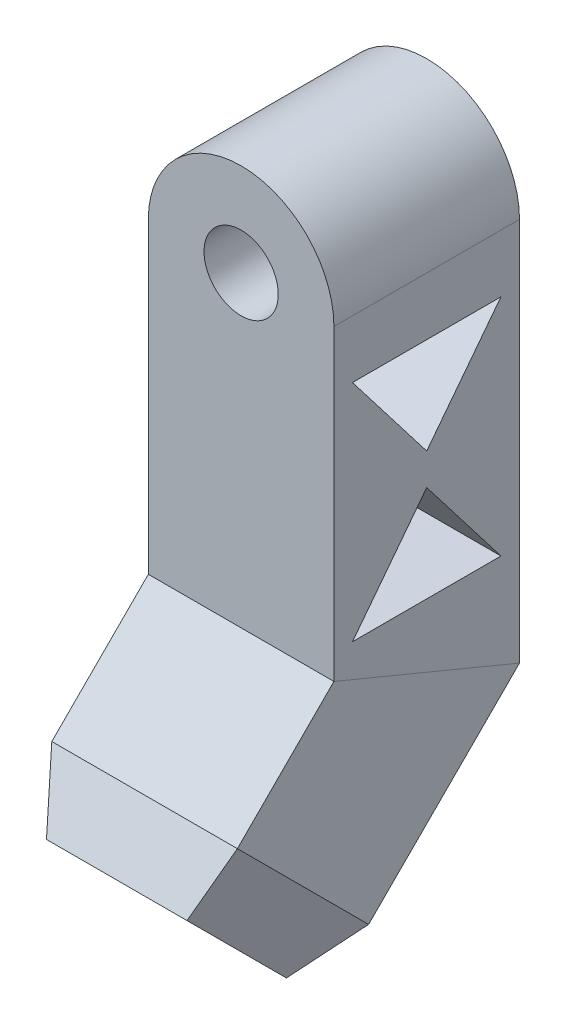
ISO-10303-21;
HEADER;
FILE_DESCRIPTION(('STEP AP214'),'2;1');
FILE_NAME('part.step','',(''),(''),'','','');
FILE_SCHEMA(('AUTOMOTIVE_DESIGN { 1 0 10303 214 1 1 1 1 }'));
ENDSEC;
DATA;
#1=APPLICATION_CONTEXT('core data for automotive mechanical design processes');
#2=APPLICATION_PROTOCOL_DEFINITION('international standard','automotive_design',2000,#1);
#3=PRODUCT_CONTEXT('',#1,'mechanical');
#4=PRODUCT('Part','Part','',(#3));
#5=PRODUCT_RELATED_PRODUCT_CATEGORY('part','',(#4));
#6=PRODUCT_DEFINITION_FORMATION('','',#4);
#7=PRODUCT_DEFINITION_CONTEXT('part definition',#1,'design');
#8=PRODUCT_DEFINITION('design','',#6,#7);
#9=PRODUCT_DEFINITION_SHAPE('','',#8);
#10=(LENGTH_UNIT() NAMED_UNIT(*) SI_UNIT(.MILLI.,.METRE.));
#11=(NAMED_UNIT(*) PLANE_ANGLE_UNIT() SI_UNIT($,.RADIAN.));
#12=(NAMED_UNIT(*) SI_UNIT($,.STERADIAN.) SOLID_ANGLE_UNIT());
#13=UNCERTAINTY_MEASURE_WITH_UNIT(LENGTH_MEASURE(1.E-05),#10,'distance_accuracy_value','');
#14=(GEOMETRIC_REPRESENTATION_CONTEXT(3) GLOBAL_UNCERTAINTY_ASSIGNED_CONTEXT((#13)) GLOBAL_UNIT_ASSIGNED_CONTEXT((#10,
#11,#12)) REPRESENTATION_CONTEXT('',''));
#15=CARTESIAN_POINT('',(0.,0.,0.));
#16=DIRECTION('',(0.,0.,1.));
#17=DIRECTION('',(1.,0.,0.));
#18=AXIS2_PLACEMENT_3D('',#15,#16,#17);
#19=CARTESIAN_POINT('',(19.05,45.0786722599583,7.26209610324912));
#20=DIRECTION('',(-1.,0.,0.));
#21=DIRECTION('',(0.,0.,1.));
#22=AXIS2_PLACEMENT_3D('',#19,#20,#21);
#23=PLANE('',#22);
#24=DIRECTION('',(0.,0.382683432365091,0.923879532511287));
#25=VECTOR('',#24,1.);
#26=CARTESIAN_POINT('',(19.05,42.5318762324136,41.3600079491902));
#27=LINE('',#26,#25);
#28=CARTESIAN_POINT('',(19.05,17.5092316367925,-19.05));
#29=VERTEX_POINT('',#28);
#30=CARTESIAN_POINT('',(19.05,33.2907683632075,19.05));
#31=VERTEX_POINT('',#30);
#32=EDGE_CURVE('E241',#29,#31,#27,.T.);
#33=ORIENTED_EDGE('',*,*,#32,.T.);
#34=DIRECTION('',(0.,-0.707106781186546,0.707106781186549));
#35=VECTOR('',#34,1.);
#36=CARTESIAN_POINT('',(19.05,45.0786722599583,7.26209610324912));
#37=LINE('',#36,#35);
#38=CARTESIAN_POINT('',(19.05,13.4703841816038,38.8703841816038));
#39=VERTEX_POINT('',#38);
#40=EDGE_CURVE('E47',#31,#39,#37,.T.);
#41=ORIENTED_EDGE('',*,*,#40,.T.);
#42=DIRECTION('',(0.,-0.707106781186549,-0.707106781186546));
#43=VECTOR('',#42,1.);
#44=CARTESIAN_POINT('',(19.05,13.4703841816038,38.8703841816038));
#45=LINE('',#44,#43);
#46=CARTESIAN_POINT('',(19.05,-13.4703841816038,11.9296158183964));
#47=VERTEX_POINT('',#46);
#48=EDGE_CURVE('E270',#39,#47,#45,.T.);
#49=ORIENTED_EDGE('',*,*,#48,.T.);
#50=DIRECTION('',(0.,-0.707106781186546,0.707106781186549));
#51=VECTOR('',#50,1.);
#52=CARTESIAN_POINT('',(19.05,18.1379038967508,-19.6786722599583));
#53=LINE('',#52,#51);
#54=EDGE_CURVE('E278',#29,#47,#53,.T.);
#55=ORIENTED_EDGE('',*,*,#54,.F.);
#56=EDGE_LOOP('',(#33,#41,#49,#55));
#57=FACE_BOUND('',#56,.T.);
#58=ADVANCED_FACE('F43',(#57),#23,.F.);
#59=CARTESIAN_POINT('',(-19.05,18.1379038967508,-19.6786722599583));
#60=DIRECTION('',(0.,0.707106781186549,0.707106781186546));
#61=DIRECTION('',(0.,-0.707106781186546,0.707106781186549));
#62=AXIS2_PLACEMENT_3D('',#59,#60,#61);
#63=PLANE('',#62);
#64=DIRECTION('',(1.,0.,0.));
#65=VECTOR('',#64,1.);
#66=CARTESIAN_POINT('',(-19.05,17.5092316367925,-19.05));
#67=LINE('',#66,#65);
#68=CARTESIAN_POINT('',(-19.05,17.5092316367925,-19.05));
#69=VERTEX_POINT('',#68);
#70=EDGE_CURVE('E11',#69,#29,#67,.T.);
#71=ORIENTED_EDGE('',*,*,#70,.T.);
#72=ORIENTED_EDGE('',*,*,#54,.T.);
#73=DIRECTION('',(-1.,0.,0.));
#74=VECTOR('',#73,1.);
#75=CARTESIAN_POINT('',(-19.05,-13.4703841816038,11.9296158183964));
#76=LINE('',#75,#74);
#77=CARTESIAN_POINT('',(-19.05,-13.4703841816038,11.9296158183964));
#78=VERTEX_POINT('',#77);
#79=EDGE_CURVE('E267',#47,#78,#76,.T.);
#80=ORIENTED_EDGE('',*,*,#79,.T.);
#81=DIRECTION('',(0.,-0.707106781186546,0.707106781186549));
#82=VECTOR('',#81,1.);
#83=CARTESIAN_POINT('',(-19.05,18.1379038967508,-19.6786722599583));
#84=LINE('',#83,#82);
#85=EDGE_CURVE('E276',#69,#78,#84,.T.);
#86=ORIENTED_EDGE('',*,*,#85,.F.);
#87=EDGE_LOOP('',(#71,#72,#80,#86));
#88=FACE_BOUND('',#87,.T.);
#89=ADVANCED_FACE('F300',(#88),#63,.F.);
#90=CARTESIAN_POINT('',(-19.05,45.0786722599583,7.26209610324912));
#91=DIRECTION('',(1.,0.,0.));
#92=DIRECTION('',(0.,0.,-1.));
#93=AXIS2_PLACEMENT_3D('',#90,#91,#92);
#94=PLANE('',#93);
#95=DIRECTION('',(0.,-0.382683432365091,-0.923879532511287));
#96=VECTOR('',#95,1.);
#97=CARTESIAN_POINT('',(-19.05,42.5318762324136,41.3600079491902));
#98=LINE('',#97,#96);
#99=CARTESIAN_POINT('',(-19.05,33.2907683632075,19.05));
#100=VERTEX_POINT('',#99);
#101=EDGE_CURVE('E52',#100,#69,#98,.T.);
#102=ORIENTED_EDGE('',*,*,#101,.T.);
#103=ORIENTED_EDGE('',*,*,#85,.T.);
#104=DIRECTION('',(0.,0.707106781186549,0.707106781186546));
#105=VECTOR('',#104,1.);
#106=CARTESIAN_POINT('',(-19.05,13.4703841816038,38.8703841816038));
#107=LINE('',#106,#105);
#108=CARTESIAN_POINT('',(-19.05,13.4703841816038,38.8703841816038));
#109=VERTEX_POINT('',#108);
#110=EDGE_CURVE('E264',#78,#109,#107,.T.);
#111=ORIENTED_EDGE('',*,*,#110,.T.);
#112=DIRECTION('',(0.,-0.707106781186546,0.707106781186549));
#113=VECTOR('',#112,1.);
#114=CARTESIAN_POINT('',(-19.05,45.0786722599583,7.26209610324912));
#115=LINE('',#114,#113);
#116=EDGE_CURVE('E273',#100,#109,#115,.T.);
#117=ORIENTED_EDGE('',*,*,#116,.F.);
#118=EDGE_LOOP('',(#102,#103,#111,#117));
#119=FACE_BOUND('',#118,.T.);
#120=ADVANCED_FACE('F298',(#119),#94,.F.);
#121=CARTESIAN_POINT('',(-19.05,45.0786722599583,7.26209610324912));
#122=DIRECTION('',(0.,-0.707106781186549,-0.707106781186546));
#123=DIRECTION('',(0.,0.707106781186546,-0.707106781186549));
#124=AXIS2_PLACEMENT_3D('',#121,#122,#123);
#125=PLANE('',#124);
#126=DIRECTION('',(-1.,0.,0.));
#127=VECTOR('',#126,1.);
#128=CARTESIAN_POINT('',(-19.05,33.2907683632075,19.05));
#129=LINE('',#128,#127);
#130=EDGE_CURVE('E238',#31,#100,#129,.T.);
#131=ORIENTED_EDGE('',*,*,#130,.T.);
#132=ORIENTED_EDGE('',*,*,#116,.T.);
#133=DIRECTION('',(1.,0.,0.));
#134=VECTOR('',#133,1.);
#135=CARTESIAN_POINT('',(-19.05,13.4703841816038,38.8703841816038));
#136=LINE('',#135,#134);
#137=EDGE_CURVE('E219',#109,#39,#136,.T.);
#138=ORIENTED_EDGE('',*,*,#137,.T.);
#139=ORIENTED_EDGE('',*,*,#40,.F.);
#140=EDGE_LOOP('',(#131,#132,#138,#139));
#141=FACE_BOUND('',#140,.T.);
#142=ADVANCED_FACE('F45',(#141),#125,.F.);
#143=CARTESIAN_POINT('',(-19.05,96.393,19.05));
#144=DIRECTION('',(0.,0.,-1.));
#145=DIRECTION('',(0.,1.,0.));
#146=AXIS2_PLACEMENT_3D('',#143,#144,#145);
#147=PLANE('',#146);
#148=CARTESIAN_POINT('',(0.,96.393,19.05));
#149=DIRECTION('',(0.,0.,1.));
#150=DIRECTION('',(1.,0.,0.));
#151=AXIS2_PLACEMENT_3D('',#148,#149,#150);
#152=CIRCLE('',#151,7.62);
#153=CARTESIAN_POINT('',(7.62,96.393,19.05));
#154=VERTEX_POINT('',#153);
#155=EDGE_CURVE('E202',#154,#154,#152,.T.);
#156=ORIENTED_EDGE('',*,*,#155,.F.);
#157=EDGE_LOOP('',(#156));
#158=FACE_BOUND('',#157,.T.);
#159=DIRECTION('',(0.,-1.,0.));
#160=VECTOR('',#159,1.);
#161=CARTESIAN_POINT('',(19.05,96.393,19.05));
#162=LINE('',#161,#160);
#163=CARTESIAN_POINT('',(19.05,96.393,19.05));
#164=VERTEX_POINT('',#163);
#165=EDGE_CURVE('E250',#164,#31,#162,.T.);
#166=ORIENTED_EDGE('',*,*,#165,.F.);
#167=CARTESIAN_POINT('',(0.,96.393,19.05));
#168=DIRECTION('',(0.,0.,-1.));
#169=DIRECTION('',(0.,1.,0.));
#170=AXIS2_PLACEMENT_3D('',#167,#168,#169);
#171=CIRCLE('',#170,19.05);
#172=CARTESIAN_POINT('',(-19.05,96.393,19.05));
#173=VERTEX_POINT('',#172);
#174=EDGE_CURVE('E211',#164,#173,#171,.F.);
#175=ORIENTED_EDGE('',*,*,#174,.T.);
#176=DIRECTION('',(0.,-1.,0.));
#177=VECTOR('',#176,1.);
#178=CARTESIAN_POINT('',(-19.05,96.393,19.05));
#179=LINE('',#178,#177);
#180=EDGE_CURVE('E255',#173,#100,#179,.T.);
#181=ORIENTED_EDGE('',*,*,#180,.T.);
#182=ORIENTED_EDGE('',*,*,#130,.F.);
#183=EDGE_LOOP('',(#166,#175,#181,#182));
#184=FACE_BOUND('',#183,.T.);
#185=ADVANCED_FACE('F331',(#158,#184),#147,.F.);
#186=CARTESIAN_POINT('',(-19.05,96.393,19.05));
#187=DIRECTION('',(1.,0.,0.));
#188=DIRECTION('',(0.,0.,-1.));
#189=AXIS2_PLACEMENT_3D('',#186,#187,#188);
#190=PLANE('',#189);
#191=DIRECTION('',(0.,-0.79225766010969,-0.610186692740443));
#192=VECTOR('',#191,1.);
#193=CARTESIAN_POINT('',(-19.05,38.4454298742545,-15.24));
#194=LINE('',#193,#192);
#195=CARTESIAN_POINT('',(-19.05,58.2328275407707,-2.22044604925031E-13));
#196=VERTEX_POINT('',#195);
#197=CARTESIAN_POINT('',(-19.05,38.4454298742545,-15.24));
#198=VERTEX_POINT('',#197);
#199=EDGE_CURVE('E167',#196,#198,#194,.T.);
#200=ORIENTED_EDGE('',*,*,#199,.F.);
#201=DIRECTION('',(0.,0.792257660109685,-0.610186692740449));
#202=VECTOR('',#201,1.);
#203=CARTESIAN_POINT('',(-19.05,58.2328275407707,-2.2940010280015E-13));
#204=LINE('',#203,#202);
#205=CARTESIAN_POINT('',(-19.05,38.4454298742543,15.24));
#206=VERTEX_POINT('',#205);
#207=EDGE_CURVE('E60',#206,#196,#204,.T.);
#208=ORIENTED_EDGE('',*,*,#207,.F.);
#209=DIRECTION('',(0.,0.,1.));
#210=VECTOR('',#209,1.);
#211=CARTESIAN_POINT('',(-19.05,38.4454298742545,-15.24));
#212=LINE('',#211,#210);
#213=EDGE_CURVE('E164',#198,#206,#212,.T.);
#214=ORIENTED_EDGE('',*,*,#213,.F.);
#215=EDGE_LOOP('',(#200,#208,#214));
#216=FACE_BOUND('',#215,.T.);
#217=DIRECTION('',(0.,0.792257660109685,0.610186692740449));
#218=VECTOR('',#217,1.);
#219=CARTESIAN_POINT('',(-19.05,64.7355055279154,-2.2940010280015E-13));
#220=LINE('',#219,#218);
#221=CARTESIAN_POINT('',(-19.05,64.7355055279154,-2.39391839684799E-13));
#222=VERTEX_POINT('',#221);
#223=CARTESIAN_POINT('',(-19.05,84.5229031944318,15.24));
#224=VERTEX_POINT('',#223);
#225=EDGE_CURVE('E187',#222,#224,#220,.T.);
#226=ORIENTED_EDGE('',*,*,#225,.F.);
#227=DIRECTION('',(0.,-0.79225766010969,0.610186692740443));
#228=VECTOR('',#227,1.);
#229=CARTESIAN_POINT('',(-19.05,84.5229031944316,-15.24));
#230=LINE('',#229,#228);
#231=CARTESIAN_POINT('',(-19.05,84.5229031944316,-15.24));
#232=VERTEX_POINT('',#231);
#233=EDGE_CURVE('E68',#232,#222,#230,.T.);
#234=ORIENTED_EDGE('',*,*,#233,.F.);
#235=DIRECTION('',(0.,0.,-1.));
#236=VECTOR('',#235,1.);
#237=CARTESIAN_POINT('',(-19.05,84.5229031944316,-15.24));
#238=LINE('',#237,#236);
#239=EDGE_CURVE('E184',#224,#232,#238,.T.);
#240=ORIENTED_EDGE('',*,*,#239,.F.);
#241=EDGE_LOOP('',(#226,#234,#240));
#242=FACE_BOUND('',#241,.T.);
#243=ORIENTED_EDGE('',*,*,#180,.F.);
#244=DIRECTION('',(0.,0.,1.));
#245=VECTOR('',#244,1.);
#246=CARTESIAN_POINT('',(-19.05,96.393,19.05));
#247=LINE('',#246,#245);
#248=CARTESIAN_POINT('',(-19.05,96.393,-19.05));
#249=VERTEX_POINT('',#248);
#250=EDGE_CURVE('E245',#249,#173,#247,.T.);
#251=ORIENTED_EDGE('',*,*,#250,.F.);
#252=DIRECTION('',(0.,-1.,0.));
#253=VECTOR('',#252,1.);
#254=CARTESIAN_POINT('',(-19.05,96.393,-19.05));
#255=LINE('',#254,#253);
#256=EDGE_CURVE('E249',#249,#69,#255,.T.);
#257=ORIENTED_EDGE('',*,*,#256,.T.);
#258=ORIENTED_EDGE('',*,*,#101,.F.);
#259=EDGE_LOOP('',(#243,#251,#257,#258));
#260=FACE_BOUND('',#259,.T.);
#261=ADVANCED_FACE('F326',(#216,#242,#260),#190,.F.);
#262=CARTESIAN_POINT('',(-19.05,96.393,-19.05));
#263=DIRECTION('',(0.,0.,1.));
#264=DIRECTION('',(0.,-1.,0.));
#265=AXIS2_PLACEMENT_3D('',#262,#263,#264);
#266=PLANE('',#265);
#267=CARTESIAN_POINT('',(0.,96.393,-19.05));
#268=DIRECTION('',(0.,0.,1.));
#269=DIRECTION('',(1.,0.,0.));
#270=AXIS2_PLACEMENT_3D('',#267,#268,#269);
#271=CIRCLE('',#270,7.62);
#272=CARTESIAN_POINT('',(7.62,96.393,-19.05));
#273=VERTEX_POINT('',#272);
#274=EDGE_CURVE('E205',#273,#273,#271,.T.);
#275=ORIENTED_EDGE('',*,*,#274,.T.);
#276=EDGE_LOOP('',(#275));
#277=FACE_BOUND('',#276,.T.);
#278=ORIENTED_EDGE('',*,*,#256,.F.);
#279=CARTESIAN_POINT('',(0.,96.393,-19.05));
#280=DIRECTION('',(0.,0.,-1.));
#281=DIRECTION('',(0.,1.,0.));
#282=AXIS2_PLACEMENT_3D('',#279,#280,#281);
#283=CIRCLE('',#282,19.05);
#284=CARTESIAN_POINT('',(19.05,96.393,-19.05));
#285=VERTEX_POINT('',#284);
#286=EDGE_CURVE('E208',#249,#285,#283,.T.);
#287=ORIENTED_EDGE('',*,*,#286,.T.);
#288=DIRECTION('',(0.,-1.,0.));
#289=VECTOR('',#288,1.);
#290=CARTESIAN_POINT('',(19.05,96.393,-19.05));
#291=LINE('',#290,#289);
#292=EDGE_CURVE('E246',#285,#29,#291,.T.);
#293=ORIENTED_EDGE('',*,*,#292,.T.);
#294=ORIENTED_EDGE('',*,*,#70,.F.);
#295=EDGE_LOOP('',(#278,#287,#293,#294));
#296=FACE_BOUND('',#295,.T.);
#297=ADVANCED_FACE('F320',(#277,#296),#266,.F.);
#298=CARTESIAN_POINT('',(19.05,96.393,19.05));
#299=DIRECTION('',(-1.,0.,0.));
#300=DIRECTION('',(0.,0.,1.));
#301=AXIS2_PLACEMENT_3D('',#298,#299,#300);
#302=PLANE('',#301);
#303=DIRECTION('',(0.,0.,1.));
#304=VECTOR('',#303,1.);
#305=CARTESIAN_POINT('',(19.05,38.4454298742545,-15.24));
#306=LINE('',#305,#304);
#307=CARTESIAN_POINT('',(19.05,38.4454298742545,-15.24));
#308=VERTEX_POINT('',#307);
#309=CARTESIAN_POINT('',(19.05,38.4454298742543,15.24));
#310=VERTEX_POINT('',#309);
#311=EDGE_CURVE('E154',#308,#310,#306,.T.);
#312=ORIENTED_EDGE('',*,*,#311,.T.);
#313=DIRECTION('',(0.,0.792257660109685,-0.610186692740449));
#314=VECTOR('',#313,1.);
#315=CARTESIAN_POINT('',(19.05,58.2328275407707,-2.2940010280015E-13));
#316=LINE('',#315,#314);
#317=CARTESIAN_POINT('',(19.05,58.2328275407707,-2.2940010280015E-13));
#318=VERTEX_POINT('',#317);
#319=EDGE_CURVE('E148',#310,#318,#316,.T.);
#320=ORIENTED_EDGE('',*,*,#319,.T.);
#321=DIRECTION('',(0.,-0.79225766010969,-0.610186692740443));
#322=VECTOR('',#321,1.);
#323=CARTESIAN_POINT('',(19.05,38.4454298742545,-15.24));
#324=LINE('',#323,#322);
#325=EDGE_CURVE('E158',#318,#308,#324,.T.);
#326=ORIENTED_EDGE('',*,*,#325,.T.);
#327=EDGE_LOOP('',(#312,#320,#326));
#328=FACE_BOUND('',#327,.T.);
#329=DIRECTION('',(0.,0.,-1.));
#330=VECTOR('',#329,1.);
#331=CARTESIAN_POINT('',(19.05,84.5229031944316,-15.24));
#332=LINE('',#331,#330);
#333=CARTESIAN_POINT('',(19.05,84.5229031944318,15.24));
#334=VERTEX_POINT('',#333);
#335=CARTESIAN_POINT('',(19.05,84.5229031944316,-15.24));
#336=VERTEX_POINT('',#335);
#337=EDGE_CURVE('E179',#334,#336,#332,.T.);
#338=ORIENTED_EDGE('',*,*,#337,.T.);
#339=DIRECTION('',(0.,-0.79225766010969,0.610186692740443));
#340=VECTOR('',#339,1.);
#341=CARTESIAN_POINT('',(19.05,84.5229031944316,-15.24));
#342=LINE('',#341,#340);
#343=CARTESIAN_POINT('',(19.05,64.7355055279154,-2.2940010280015E-13));
#344=VERTEX_POINT('',#343);
#345=EDGE_CURVE('E188',#336,#344,#342,.T.);
#346=ORIENTED_EDGE('',*,*,#345,.T.);
#347=DIRECTION('',(0.,0.792257660109685,0.610186692740449));
#348=VECTOR('',#347,1.);
#349=CARTESIAN_POINT('',(19.05,64.7355055279154,-2.2940010280015E-13));
#350=LINE('',#349,#348);
#351=EDGE_CURVE('E194',#344,#334,#350,.T.);
#352=ORIENTED_EDGE('',*,*,#351,.T.);
#353=EDGE_LOOP('',(#338,#346,#352));
#354=FACE_BOUND('',#353,.T.);
#355=ORIENTED_EDGE('',*,*,#292,.F.);
#356=DIRECTION('',(0.,0.,-1.));
#357=VECTOR('',#356,1.);
#358=CARTESIAN_POINT('',(19.05,96.393,19.05));
#359=LINE('',#358,#357);
#360=EDGE_CURVE('E242',#164,#285,#359,.T.);
#361=ORIENTED_EDGE('',*,*,#360,.F.);
#362=ORIENTED_EDGE('',*,*,#165,.T.);
#363=ORIENTED_EDGE('',*,*,#32,.F.);
#364=EDGE_LOOP('',(#355,#361,#362,#363));
#365=FACE_BOUND('',#364,.T.);
#366=ADVANCED_FACE('F162',(#328,#354,#365),#302,.F.);
#367=CARTESIAN_POINT('',(-19.05,-13.4703841816038,11.9296158183964));
#368=DIRECTION('',(0.,-0.906307787036651,-0.422618261740697));
#369=DIRECTION('',(0.,0.422618261740697,-0.906307787036651));
#370=AXIS2_PLACEMENT_3D('',#367,#368,#369);
#371=PLANE('',#370);
#372=ORIENTED_EDGE('',*,*,#79,.F.);
#373=DIRECTION('',(0.323615577118185,0.399876601840004,-0.857538139995741));
#374=VECTOR('',#373,1.);
#375=CARTESIAN_POINT('',(19.05,-13.4703841816038,11.9296158183964));
#376=LINE('',#375,#374);
#377=CARTESIAN_POINT('',(14.4275780248192,-19.1820943785168,24.1784178636216));
#378=VERTEX_POINT('',#377);
#379=EDGE_CURVE('E217',#378,#47,#376,.T.);
#380=ORIENTED_EDGE('',*,*,#379,.F.);
#381=DIRECTION('',(-1.,0.,0.));
#382=VECTOR('',#381,1.);
#383=CARTESIAN_POINT('',(-19.05,-19.1820943785168,24.1784178636216));
#384=LINE('',#383,#382);
#385=CARTESIAN_POINT('',(-14.4275780248192,-19.1820943785168,24.1784178636216));
#386=VERTEX_POINT('',#385);
#387=EDGE_CURVE('E214',#386,#378,#384,.F.);
#388=ORIENTED_EDGE('',*,*,#387,.F.);
#389=DIRECTION('',(-0.323615577118185,0.399876601840004,-0.857538139995741));
#390=VECTOR('',#389,1.);
#391=CARTESIAN_POINT('',(-19.05,-13.4703841816038,11.9296158183964));
#392=LINE('',#391,#390);
#393=EDGE_CURVE('E221',#386,#78,#392,.T.);
#394=ORIENTED_EDGE('',*,*,#393,.T.);
#395=EDGE_LOOP('',(#372,#380,#388,#394));
#396=FACE_BOUND('',#395,.T.);
#397=ADVANCED_FACE('F304',(#396),#371,.T.);
#398=CARTESIAN_POINT('',(19.05,-13.4703841816038,11.9296158183964));
#399=DIRECTION('',(0.939692620785908,-0.241844762647975,0.241844762647976));
#400=DIRECTION('',(0.249243569363955,0.,-0.968440830991091));
#401=AXIS2_PLACEMENT_3D('',#398,#399,#400);
#402=PLANE('',#401);
#403=ORIENTED_EDGE('',*,*,#48,.F.);
#404=DIRECTION('',(0.323615577118185,0.857538139995739,-0.399876601840008));
#405=VECTOR('',#404,1.);
#406=CARTESIAN_POINT('',(19.05,13.4703841816038,38.8703841816038));
#407=LINE('',#406,#405);
#408=CARTESIAN_POINT('',(14.4275780248192,1.22158213637858,44.5820943785169));
#409=VERTEX_POINT('',#408);
#410=EDGE_CURVE('E220',#409,#39,#407,.T.);
#411=ORIENTED_EDGE('',*,*,#410,.F.);
#412=DIRECTION('',(0.,-0.707106781186549,-0.707106781186546));
#413=VECTOR('',#412,1.);
#414=CARTESIAN_POINT('',(14.4275780248192,-22.4506403026729,20.9098719394655));
#415=LINE('',#414,#413);
#416=EDGE_CURVE('E231',#378,#409,#415,.F.);
#417=ORIENTED_EDGE('',*,*,#416,.F.);
#418=ORIENTED_EDGE('',*,*,#379,.T.);
#419=EDGE_LOOP('',(#403,#411,#417,#418));
#420=FACE_BOUND('',#419,.T.);
#421=ADVANCED_FACE('F309',(#420),#402,.T.);
#422=CARTESIAN_POINT('',(19.05,13.4703841816038,38.8703841816038));
#423=DIRECTION('',(0.,0.4226182617407,0.906307787036649));
#424=DIRECTION('',(0.,-0.90630778703665,0.4226182617407));
#425=AXIS2_PLACEMENT_3D('',#422,#423,#424);
#426=PLANE('',#425);
#427=ORIENTED_EDGE('',*,*,#137,.F.);
#428=DIRECTION('',(-0.323615577118185,0.857538139995739,-0.399876601840008));
#429=VECTOR('',#428,1.);
#430=CARTESIAN_POINT('',(-19.05,13.4703841816038,38.8703841816038));
#431=LINE('',#430,#429);
#432=CARTESIAN_POINT('',(-14.4275780248192,1.22158213637858,44.5820943785169));
#433=VERTEX_POINT('',#432);
#434=EDGE_CURVE('E224',#433,#109,#431,.T.);
#435=ORIENTED_EDGE('',*,*,#434,.F.);
#436=DIRECTION('',(1.,0.,0.));
#437=VECTOR('',#436,1.);
#438=CARTESIAN_POINT('',(19.05,1.22158213637857,44.5820943785169));
#439=LINE('',#438,#437);
#440=EDGE_CURVE('E233',#409,#433,#439,.F.);
#441=ORIENTED_EDGE('',*,*,#440,.F.);
#442=ORIENTED_EDGE('',*,*,#410,.T.);
#443=EDGE_LOOP('',(#427,#435,#441,#442));
#444=FACE_BOUND('',#443,.T.);
#445=ADVANCED_FACE('F290',(#444),#426,.T.);
#446=CARTESIAN_POINT('',(-19.05,13.4703841816038,38.8703841816038));
#447=DIRECTION('',(-0.939692620785908,-0.241844762647975,0.241844762647976));
#448=DIRECTION('',(0.249243569363955,0.,0.968440830991091));
#449=AXIS2_PLACEMENT_3D('',#446,#447,#448);
#450=PLANE('',#449);
#451=ORIENTED_EDGE('',*,*,#110,.F.);
#452=ORIENTED_EDGE('',*,*,#393,.F.);
#453=DIRECTION('',(0.,0.707106781186549,0.707106781186546));
#454=VECTOR('',#453,1.);
#455=CARTESIAN_POINT('',(-14.4275780248192,4.49012806053463,47.850640302673));
#456=LINE('',#455,#454);
#457=EDGE_CURVE('E225',#433,#386,#456,.F.);
#458=ORIENTED_EDGE('',*,*,#457,.F.);
#459=ORIENTED_EDGE('',*,*,#434,.T.);
#460=EDGE_LOOP('',(#451,#452,#458,#459));
#461=FACE_BOUND('',#460,.T.);
#462=ADVANCED_FACE('F295',(#461),#450,.T.);
#463=CARTESIAN_POINT('',(0.,-21.6802561210692,21.6802561210693));
#464=DIRECTION('',(0.,-0.707106781186546,0.707106781186549));
#465=DIRECTION('',(0.,-0.707106781186549,-0.707106781186546));
#466=AXIS2_PLACEMENT_3D('',#463,#464,#465);
#467=PLANE('',#466);
#468=CARTESIAN_POINT('',(0.,-8.98025612106913,34.3802561210692));
#469=DIRECTION('',(0.,-0.707106781186546,0.707106781186549));
#470=DIRECTION('',(0.,-0.707106781186549,-0.707106781186546));
#471=AXIS2_PLACEMENT_3D('',#468,#469,#470);
#472=CIRCLE('',#471,12.065);
#473=CARTESIAN_POINT('',(0.,-17.5114994360848,25.8490128060536));
#474=VERTEX_POINT('',#473);
#475=EDGE_CURVE('E175',#474,#474,#472,.T.);
#476=ORIENTED_EDGE('',*,*,#475,.F.);
#477=EDGE_LOOP('',(#476));
#478=FACE_BOUND('',#477,.T.);
#479=ORIENTED_EDGE('',*,*,#387,.T.);
#480=ORIENTED_EDGE('',*,*,#416,.T.);
#481=ORIENTED_EDGE('',*,*,#440,.T.);
#482=ORIENTED_EDGE('',*,*,#457,.T.);
#483=EDGE_LOOP('',(#479,#480,#481,#482));
#484=FACE_BOUND('',#483,.T.);
#485=ADVANCED_FACE('F307',(#478,#484),#467,.T.);
#486=CARTESIAN_POINT('',(0.,96.393,61.647094971371));
#487=DIRECTION('',(0.,0.,-1.));
#488=DIRECTION('',(0.,1.,0.));
#489=AXIS2_PLACEMENT_3D('',#486,#487,#488);
#490=CYLINDRICAL_SURFACE('',#489,19.05);
#491=ORIENTED_EDGE('',*,*,#174,.F.);
#492=ORIENTED_EDGE('',*,*,#360,.T.);
#493=ORIENTED_EDGE('',*,*,#286,.F.);
#494=ORIENTED_EDGE('',*,*,#250,.T.);
#495=EDGE_LOOP('',(#491,#492,#493,#494));
#496=FACE_BOUND('',#495,.T.);
#497=ADVANCED_FACE('F384',(#496),#490,.T.);
#498=CARTESIAN_POINT('',(0.,96.393,-19.05));
#499=DIRECTION('',(0.,0.,1.));
#500=DIRECTION('',(1.,0.,0.));
#501=AXIS2_PLACEMENT_3D('',#498,#499,#500);
#502=CYLINDRICAL_SURFACE('',#501,7.62);
#503=CARTESIAN_POINT('',(7.62,96.393,-19.05));
#504=CARTESIAN_POINT('',(7.62,96.393,-18.653125));
#505=CARTESIAN_POINT('',(7.62,96.393,-18.25625));
#506=CARTESIAN_POINT('',(7.62,96.393,-17.4625));
#507=CARTESIAN_POINT('',(7.62,96.393,-17.065625));
#508=CARTESIAN_POINT('',(7.62,96.393,-16.271875));
#509=CARTESIAN_POINT('',(7.62,96.393,-15.875));
#510=CARTESIAN_POINT('',(7.62,96.393,-15.08125));
#511=CARTESIAN_POINT('',(7.62,96.393,-14.684375));
#512=CARTESIAN_POINT('',(7.62,96.393,-13.890625));
#513=CARTESIAN_POINT('',(7.62,96.393,-13.49375));
#514=CARTESIAN_POINT('',(7.62,96.393,-12.7));
#515=CARTESIAN_POINT('',(7.62,96.393,-12.303125));
#516=CARTESIAN_POINT('',(7.62,96.393,-11.509375));
#517=CARTESIAN_POINT('',(7.62,96.393,-11.1125));
#518=CARTESIAN_POINT('',(7.62,96.393,-10.31875));
#519=CARTESIAN_POINT('',(7.62,96.393,-9.92187500000001));
#520=CARTESIAN_POINT('',(7.62,96.393,-9.12812500000001));
#521=CARTESIAN_POINT('',(7.62,96.393,-8.73125000000001));
#522=CARTESIAN_POINT('',(7.62,96.393,-7.93750000000001));
#523=CARTESIAN_POINT('',(7.62,96.393,-7.54062500000001));
#524=CARTESIAN_POINT('',(7.62,96.393,-6.74687500000001));
#525=CARTESIAN_POINT('',(7.62,96.393,-6.35000000000001));
#526=CARTESIAN_POINT('',(7.62,96.393,-5.55625000000001));
#527=CARTESIAN_POINT('',(7.62,96.393,-5.15937500000001));
#528=CARTESIAN_POINT('',(7.62,96.393,-4.36562500000001));
#529=CARTESIAN_POINT('',(7.62,96.393,-3.96875000000001));
#530=CARTESIAN_POINT('',(7.62,96.393,-3.17500000000001));
#531=CARTESIAN_POINT('',(7.62,96.393,-2.77812500000001));
#532=CARTESIAN_POINT('',(7.62,96.393,-1.98437500000001));
#533=CARTESIAN_POINT('',(7.62,96.393,-1.58750000000001));
#534=CARTESIAN_POINT('',(7.62,96.393,-0.793750000000011));
#535=CARTESIAN_POINT('',(7.62,96.393,-0.396875000000011));
#536=CARTESIAN_POINT('',(7.62,96.393,0.39687499999999));
#537=CARTESIAN_POINT('',(7.62,96.393,0.79374999999999));
#538=CARTESIAN_POINT('',(7.62,96.393,1.58749999999999));
#539=CARTESIAN_POINT('',(7.62,96.393,1.98437499999999));
#540=CARTESIAN_POINT('',(7.62,96.393,2.77812499999999));
#541=CARTESIAN_POINT('',(7.62,96.393,3.17499999999999));
#542=CARTESIAN_POINT('',(7.62,96.393,3.96874999999999));
#543=CARTESIAN_POINT('',(7.62,96.393,4.36562499999999));
#544=CARTESIAN_POINT('',(7.62,96.393,5.15937499999999));
#545=CARTESIAN_POINT('',(7.62,96.393,5.55624999999999));
#546=CARTESIAN_POINT('',(7.62,96.393,6.34999999999999));
#547=CARTESIAN_POINT('',(7.62,96.393,6.74687499999999));
#548=CARTESIAN_POINT('',(7.62,96.393,7.54062499999999));
#549=CARTESIAN_POINT('',(7.62,96.393,7.93749999999999));
#550=CARTESIAN_POINT('',(7.62,96.393,8.73124999999999));
#551=CARTESIAN_POINT('',(7.62,96.393,9.12812499999999));
#552=CARTESIAN_POINT('',(7.62,96.393,9.92187499999999));
#553=CARTESIAN_POINT('',(7.62,96.393,10.31875));
#554=CARTESIAN_POINT('',(7.62,96.393,11.1125));
#555=CARTESIAN_POINT('',(7.62,96.393,11.509375));
#556=CARTESIAN_POINT('',(7.62,96.393,12.303125));
#557=CARTESIAN_POINT('',(7.62,96.393,12.7));
#558=CARTESIAN_POINT('',(7.62,96.393,13.49375));
#559=CARTESIAN_POINT('',(7.62,96.393,13.890625));
#560=CARTESIAN_POINT('',(7.62,96.393,14.684375));
#561=CARTESIAN_POINT('',(7.62,96.393,15.08125));
#562=CARTESIAN_POINT('',(7.62,96.393,15.875));
#563=CARTESIAN_POINT('',(7.62,96.393,16.271875));
#564=CARTESIAN_POINT('',(7.62,96.393,17.065625));
#565=CARTESIAN_POINT('',(7.62,96.393,17.4625));
#566=CARTESIAN_POINT('',(7.62,96.393,18.25625));
#567=CARTESIAN_POINT('',(7.62,96.393,18.653125));
#568=CARTESIAN_POINT('',(7.62,96.393,19.05));
#569=B_SPLINE_CURVE_WITH_KNOTS('',3,(#503,#504,#505,#506,#507,#508,#509,#510,#511,#512,#513,
#514,#515,#516,#517,#518,#519,#520,#521,#522,#523,#524,#525,#526,#527,#528,#529,#530,#531,#532,
#533,#534,#535,#536,#537,#538,#539,#540,#541,#542,#543,#544,#545,#546,#547,#548,#549,#550,#551,
#552,#553,#554,#555,#556,#557,#558,#559,#560,#561,#562,#563,#564,#565,#566,#567,#568),
.UNSPECIFIED.,.F.,.F.,(4,2,2,2,2,2,2,2,2,2,2,2,2,2,2,2,2,2,2,2,2,2,2,2,2,2,2,2,2,2,2,2,4),(0.,
1.190625,2.38125,3.571875,4.7625,5.953125,7.14375,8.334375,9.525,10.715625,11.90625,13.096875,
14.2875,15.478125,16.66875,17.859375,19.05,20.240625,21.43125,22.621875,23.8125,25.003125,
26.19375,27.384375,28.575,29.765625,30.95625,32.146875,33.3375,34.528125,35.71875,36.909375,
38.1),.UNSPECIFIED.);
#570=EDGE_CURVE('BSEAM410',#273,#154,#569,.T.);
#571=ORIENTED_EDGE('',*,*,#274,.F.);
#572=ORIENTED_EDGE('',*,*,#155,.T.);
#573=ORIENTED_EDGE('',*,*,#570,.T.);
#574=ORIENTED_EDGE('',*,*,#570,.F.);
#575=EDGE_LOOP('',(#571,#573,#572,#574));
#576=FACE_BOUND('',#575,.T.);
#577=ADVANCED_FACE('F410',(#576),#502,.F.);
#578=CARTESIAN_POINT('',(0.,0.,25.4000000000001));
#579=DIRECTION('',(0.,-0.707106781186546,0.707106781186549));
#580=DIRECTION('',(0.,-0.707106781186549,-0.707106781186546));
#581=AXIS2_PLACEMENT_3D('',#578,#579,#580);
#582=CYLINDRICAL_SURFACE('',#581,12.065);
#583=CARTESIAN_POINT('',(0.,0.,25.4000000000001));
#584=DIRECTION('',(0.,-0.707106781186546,0.707106781186549));
#585=DIRECTION('',(0.,-0.707106781186549,-0.707106781186546));
#586=AXIS2_PLACEMENT_3D('',#583,#584,#585);
#587=CIRCLE('',#586,12.065);
#588=CARTESIAN_POINT('',(0.,-8.53124331501571,16.8687566849844));
#589=VERTEX_POINT('',#588);
#590=EDGE_CURVE('E199',#589,#589,#587,.T.);
#591=ORIENTED_EDGE('',*,*,#590,.F.);
#592=EDGE_LOOP('',(#591));
#593=FACE_BOUND('',#592,.T.);
#594=ORIENTED_EDGE('',*,*,#475,.T.);
#595=EDGE_LOOP('',(#594));
#596=FACE_BOUND('',#595,.T.);
#597=ADVANCED_FACE('F419',(#593,#596),#582,.F.);
#598=CARTESIAN_POINT('',(0.,0.,25.4000000000001));
#599=DIRECTION('',(0.,-0.707106781186546,0.707106781186549));
#600=DIRECTION('',(0.,-0.707106781186549,-0.707106781186546));
#601=AXIS2_PLACEMENT_3D('',#598,#599,#600);
#602=PLANE('',#601);
#603=ORIENTED_EDGE('',*,*,#590,.T.);
#604=EDGE_LOOP('',(#603));
#605=FACE_BOUND('',#604,.T.);
#606=ADVANCED_FACE('F428',(#605),#602,.T.);
#607=CARTESIAN_POINT('',(19.05,84.5229031944316,-15.24));
#608=DIRECTION('',(0.,-0.610186692740443,-0.79225766010969));
#609=DIRECTION('',(0.,0.79225766010969,-0.610186692740443));
#610=AXIS2_PLACEMENT_3D('',#607,#608,#609);
#611=PLANE('',#610);
#612=ORIENTED_EDGE('',*,*,#233,.T.);
#613=DIRECTION('',(-1.,0.,0.));
#614=VECTOR('',#613,1.);
#615=CARTESIAN_POINT('',(19.05,64.7355055279154,-2.2940010280015E-13));
#616=LINE('',#615,#614);
#617=EDGE_CURVE('E177',#344,#222,#616,.T.);
#618=ORIENTED_EDGE('',*,*,#617,.F.);
#619=ORIENTED_EDGE('',*,*,#345,.F.);
#620=DIRECTION('',(-1.,0.,0.));
#621=VECTOR('',#620,1.);
#622=CARTESIAN_POINT('',(19.05,84.5229031944316,-15.24));
#623=LINE('',#622,#621);
#624=EDGE_CURVE('E182',#336,#232,#623,.T.);
#625=ORIENTED_EDGE('',*,*,#624,.T.);
#626=EDGE_LOOP('',(#612,#618,#619,#625));
#627=FACE_BOUND('',#626,.T.);
#628=ADVANCED_FACE('F438',(#627),#611,.F.);
#629=CARTESIAN_POINT('',(19.05,84.5229031944316,-15.24));
#630=DIRECTION('',(0.,1.,0.));
#631=DIRECTION('',(0.,0.,1.));
#632=AXIS2_PLACEMENT_3D('',#629,#630,#631);
#633=PLANE('',#632);
#634=ORIENTED_EDGE('',*,*,#239,.T.);
#635=ORIENTED_EDGE('',*,*,#624,.F.);
#636=ORIENTED_EDGE('',*,*,#337,.F.);
#637=DIRECTION('',(-1.,0.,0.));
#638=VECTOR('',#637,1.);
#639=CARTESIAN_POINT('',(19.05,84.5229031944318,15.24));
#640=LINE('',#639,#638);
#641=EDGE_CURVE('E180',#334,#224,#640,.T.);
#642=ORIENTED_EDGE('',*,*,#641,.T.);
#643=EDGE_LOOP('',(#634,#635,#636,#642));
#644=FACE_BOUND('',#643,.T.);
#645=ADVANCED_FACE('F447',(#644),#633,.F.);
#646=CARTESIAN_POINT('',(19.05,64.7355055279154,-2.2940010280015E-13));
#647=DIRECTION('',(0.,-0.610186692740449,0.792257660109685));
#648=DIRECTION('',(0.,-0.792257660109685,-0.610186692740449));
#649=AXIS2_PLACEMENT_3D('',#646,#647,#648);
#650=PLANE('',#649);
#651=ORIENTED_EDGE('',*,*,#225,.T.);
#652=ORIENTED_EDGE('',*,*,#641,.F.);
#653=ORIENTED_EDGE('',*,*,#351,.F.);
#654=ORIENTED_EDGE('',*,*,#617,.T.);
#655=EDGE_LOOP('',(#651,#652,#653,#654));
#656=FACE_BOUND('',#655,.T.);
#657=ADVANCED_FACE('F456',(#656),#650,.F.);
#658=CARTESIAN_POINT('',(19.05,58.2328275407707,-2.2940010280015E-13));
#659=DIRECTION('',(0.,0.610186692740449,0.792257660109685));
#660=DIRECTION('',(0.,-0.792257660109685,0.610186692740449));
#661=AXIS2_PLACEMENT_3D('',#658,#659,#660);
#662=PLANE('',#661);
#663=ORIENTED_EDGE('',*,*,#207,.T.);
#664=DIRECTION('',(-1.,0.,0.));
#665=VECTOR('',#664,1.);
#666=CARTESIAN_POINT('',(19.05,58.2328275407707,-2.2940010280015E-13));
#667=LINE('',#666,#665);
#668=EDGE_CURVE('E144',#318,#196,#667,.T.);
#669=ORIENTED_EDGE('',*,*,#668,.F.);
#670=ORIENTED_EDGE('',*,*,#319,.F.);
#671=DIRECTION('',(-1.,0.,0.));
#672=VECTOR('',#671,1.);
#673=CARTESIAN_POINT('',(19.05,38.4454298742543,15.24));
#674=LINE('',#673,#672);
#675=EDGE_CURVE('E173',#310,#206,#674,.T.);
#676=ORIENTED_EDGE('',*,*,#675,.T.);
#677=EDGE_LOOP('',(#663,#669,#670,#676));
#678=FACE_BOUND('',#677,.T.);
#679=ADVANCED_FACE('F146',(#678),#662,.F.);
#680=CARTESIAN_POINT('',(19.05,38.4454298742545,-15.24));
#681=DIRECTION('',(0.,-1.,0.));
#682=DIRECTION('',(0.,0.,-1.));
#683=AXIS2_PLACEMENT_3D('',#680,#681,#682);
#684=PLANE('',#683);
#685=ORIENTED_EDGE('',*,*,#213,.T.);
#686=ORIENTED_EDGE('',*,*,#675,.F.);
#687=ORIENTED_EDGE('',*,*,#311,.F.);
#688=DIRECTION('',(-1.,0.,0.));
#689=VECTOR('',#688,1.);
#690=CARTESIAN_POINT('',(19.05,38.4454298742545,-15.24));
#691=LINE('',#690,#689);
#692=EDGE_CURVE('E153',#308,#198,#691,.T.);
#693=ORIENTED_EDGE('',*,*,#692,.T.);
#694=EDGE_LOOP('',(#685,#686,#687,#693));
#695=FACE_BOUND('',#694,.T.);
#696=ADVANCED_FACE('F475',(#695),#684,.F.);
#697=CARTESIAN_POINT('',(19.05,38.4454298742545,-15.24));
#698=DIRECTION('',(0.,0.610186692740442,-0.79225766010969));
#699=DIRECTION('',(0.,0.79225766010969,0.610186692740443));
#700=AXIS2_PLACEMENT_3D('',#697,#698,#699);
#701=PLANE('',#700);
#702=ORIENTED_EDGE('',*,*,#199,.T.);
#703=ORIENTED_EDGE('',*,*,#692,.F.);
#704=ORIENTED_EDGE('',*,*,#325,.F.);
#705=ORIENTED_EDGE('',*,*,#668,.T.);
#706=EDGE_LOOP('',(#702,#703,#704,#705));
#707=FACE_BOUND('',#706,.T.);
#708=ADVANCED_FACE('F159',(#707),#701,.F.);
#709=CLOSED_SHELL('',(#58,#89,#120,#142,#185,#261,#297,#366,#397,#421,#445,#462,#485,#497,#577,
#597,#606,#628,#645,#657,#679,#696,#708));
#710=MANIFOLD_SOLID_BREP('B2',#709);
#711=ADVANCED_BREP_SHAPE_REPRESENTATION('',(#18,#710),#14);
#712=SHAPE_DEFINITION_REPRESENTATION(#9,#711);
ENDSEC;
END-ISO-10303-21;
